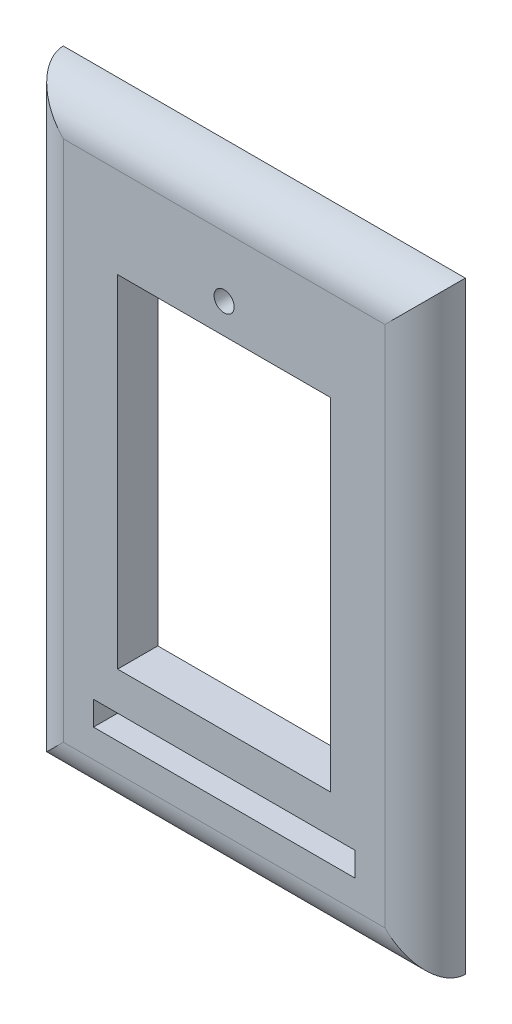
ISO-10303-21;
HEADER;
FILE_DESCRIPTION(('STEP AP214'),'2;1');
FILE_NAME('part.step','',(''),(''),'','','');
FILE_SCHEMA(('AUTOMOTIVE_DESIGN { 1 0 10303 214 1 1 1 1 }'));
ENDSEC;
DATA;
#1=APPLICATION_CONTEXT('core data for automotive mechanical design processes');
#2=APPLICATION_PROTOCOL_DEFINITION('international standard','automotive_design',2000,#1);
#3=PRODUCT_CONTEXT('',#1,'mechanical');
#4=PRODUCT('Part','Part','',(#3));
#5=PRODUCT_RELATED_PRODUCT_CATEGORY('part','',(#4));
#6=PRODUCT_DEFINITION_FORMATION('','',#4);
#7=PRODUCT_DEFINITION_CONTEXT('part definition',#1,'design');
#8=PRODUCT_DEFINITION('design','',#6,#7);
#9=PRODUCT_DEFINITION_SHAPE('','',#8);
#10=(LENGTH_UNIT() NAMED_UNIT(*) SI_UNIT(.MILLI.,.METRE.));
#11=(NAMED_UNIT(*) PLANE_ANGLE_UNIT() SI_UNIT($,.RADIAN.));
#12=(NAMED_UNIT(*) SI_UNIT($,.STERADIAN.) SOLID_ANGLE_UNIT());
#13=UNCERTAINTY_MEASURE_WITH_UNIT(LENGTH_MEASURE(1.E-05),#10,'distance_accuracy_value','');
#14=(GEOMETRIC_REPRESENTATION_CONTEXT(3) GLOBAL_UNCERTAINTY_ASSIGNED_CONTEXT((#13)) GLOBAL_UNIT_ASSIGNED_CONTEXT((#10,
#11,#12)) REPRESENTATION_CONTEXT('',''));
#15=CARTESIAN_POINT('',(0.,0.,0.));
#16=DIRECTION('',(0.,0.,1.));
#17=DIRECTION('',(1.,0.,0.));
#18=AXIS2_PLACEMENT_3D('',#15,#16,#17);
#19=CARTESIAN_POINT('',(0.,65.,0.));
#20=DIRECTION('',(1.,0.,0.));
#21=DIRECTION('',(0.,0.,-1.));
#22=AXIS2_PLACEMENT_3D('',#19,#20,#21);
#23=CYLINDRICAL_SURFACE('',#22,10.);
#24=CARTESIAN_POINT('',(-40.,65.,0.));
#25=DIRECTION('',(0.707106781186547,0.707106781186547,0.));
#26=DIRECTION('',(-0.707106781186547,0.707106781186547,0.));
#27=AXIS2_PLACEMENT_3D('',#24,#25,#26);
#28=ELLIPSE('',#27,14.1421356237309,10.);
#29=CARTESIAN_POINT('',(-40.,65.,10.));
#30=VERTEX_POINT('',#29);
#31=CARTESIAN_POINT('',(-50.,75.,0.));
#32=VERTEX_POINT('',#31);
#33=EDGE_CURVE('E11',#30,#32,#28,.F.);
#34=ORIENTED_EDGE('',*,*,#33,.F.);
#35=DIRECTION('',(-1.,0.,0.));
#36=VECTOR('',#35,1.);
#37=CARTESIAN_POINT('',(0.,65.,10.));
#38=LINE('',#37,#36);
#39=CARTESIAN_POINT('',(40.,65.,10.));
#40=VERTEX_POINT('',#39);
#41=EDGE_CURVE('E206',#40,#30,#38,.T.);
#42=ORIENTED_EDGE('',*,*,#41,.F.);
#43=CARTESIAN_POINT('',(40.,65.,0.));
#44=DIRECTION('',(0.707106781186547,-0.707106781186547,0.));
#45=DIRECTION('',(0.707106781186547,0.707106781186547,0.));
#46=AXIS2_PLACEMENT_3D('',#43,#44,#45);
#47=ELLIPSE('',#46,14.1421356237309,10.);
#48=CARTESIAN_POINT('',(50.,75.,0.));
#49=VERTEX_POINT('',#48);
#50=EDGE_CURVE('E40',#40,#49,#47,.F.);
#51=ORIENTED_EDGE('',*,*,#50,.T.);
#52=DIRECTION('',(-1.,0.,0.));
#53=VECTOR('',#52,1.);
#54=CARTESIAN_POINT('',(50.,75.,0.));
#55=LINE('',#54,#53);
#56=EDGE_CURVE('E203',#49,#32,#55,.T.);
#57=ORIENTED_EDGE('',*,*,#56,.T.);
#58=EDGE_LOOP('',(#34,#42,#51,#57));
#59=FACE_BOUND('',#58,.T.);
#60=ADVANCED_FACE('F33',(#59),#23,.T.);
#61=CARTESIAN_POINT('',(40.,0.,0.));
#62=DIRECTION('',(0.,-1.,0.));
#63=DIRECTION('',(0.,0.,-1.));
#64=AXIS2_PLACEMENT_3D('',#61,#62,#63);
#65=CYLINDRICAL_SURFACE('',#64,10.);
#66=ORIENTED_EDGE('',*,*,#50,.F.);
#67=DIRECTION('',(0.,1.,0.));
#68=VECTOR('',#67,1.);
#69=CARTESIAN_POINT('',(40.,0.,10.));
#70=LINE('',#69,#68);
#71=CARTESIAN_POINT('',(40.,-65.,10.));
#72=VERTEX_POINT('',#71);
#73=EDGE_CURVE('E209',#72,#40,#70,.T.);
#74=ORIENTED_EDGE('',*,*,#73,.F.);
#75=CARTESIAN_POINT('',(40.,-65.,0.));
#76=DIRECTION('',(-0.707106781186547,-0.707106781186548,0.));
#77=DIRECTION('',(0.707106781186548,-0.707106781186547,0.));
#78=AXIS2_PLACEMENT_3D('',#75,#76,#77);
#79=ELLIPSE('',#78,14.1421356237309,10.);
#80=CARTESIAN_POINT('',(50.,-75.,0.));
#81=VERTEX_POINT('',#80);
#82=EDGE_CURVE('E220',#72,#81,#79,.F.);
#83=ORIENTED_EDGE('',*,*,#82,.T.);
#84=DIRECTION('',(0.,1.,0.));
#85=VECTOR('',#84,1.);
#86=CARTESIAN_POINT('',(50.,-75.,0.));
#87=LINE('',#86,#85);
#88=EDGE_CURVE('E200',#81,#49,#87,.T.);
#89=ORIENTED_EDGE('',*,*,#88,.T.);
#90=EDGE_LOOP('',(#66,#74,#83,#89));
#91=FACE_BOUND('',#90,.T.);
#92=ADVANCED_FACE('F228',(#91),#65,.T.);
#93=CARTESIAN_POINT('',(0.,-65.,0.));
#94=DIRECTION('',(-1.,0.,0.));
#95=DIRECTION('',(0.,-1.,0.));
#96=AXIS2_PLACEMENT_3D('',#93,#94,#95);
#97=CYLINDRICAL_SURFACE('',#96,10.);
#98=ORIENTED_EDGE('',*,*,#82,.F.);
#99=DIRECTION('',(1.,0.,0.));
#100=VECTOR('',#99,1.);
#101=CARTESIAN_POINT('',(0.,-65.,10.));
#102=LINE('',#101,#100);
#103=CARTESIAN_POINT('',(-40.,-65.,10.));
#104=VERTEX_POINT('',#103);
#105=EDGE_CURVE('E212',#104,#72,#102,.T.);
#106=ORIENTED_EDGE('',*,*,#105,.F.);
#107=CARTESIAN_POINT('',(-40.,-65.,0.));
#108=DIRECTION('',(-0.707106781186548,0.707106781186547,0.));
#109=DIRECTION('',(-0.707106781186547,-0.707106781186548,0.));
#110=AXIS2_PLACEMENT_3D('',#107,#108,#109);
#111=ELLIPSE('',#110,14.142135623731,10.);
#112=CARTESIAN_POINT('',(-50.,-75.,0.));
#113=VERTEX_POINT('',#112);
#114=EDGE_CURVE('E218',#104,#113,#111,.F.);
#115=ORIENTED_EDGE('',*,*,#114,.T.);
#116=DIRECTION('',(1.,0.,0.));
#117=VECTOR('',#116,1.);
#118=CARTESIAN_POINT('',(50.,-75.,0.));
#119=LINE('',#118,#117);
#120=EDGE_CURVE('E197',#113,#81,#119,.T.);
#121=ORIENTED_EDGE('',*,*,#120,.T.);
#122=EDGE_LOOP('',(#98,#106,#115,#121));
#123=FACE_BOUND('',#122,.T.);
#124=ADVANCED_FACE('F238',(#123),#97,.T.);
#125=CARTESIAN_POINT('',(-40.,0.,0.));
#126=DIRECTION('',(0.,1.,0.));
#127=DIRECTION('',(0.,0.,1.));
#128=AXIS2_PLACEMENT_3D('',#125,#126,#127);
#129=CYLINDRICAL_SURFACE('',#128,10.);
#130=DIRECTION('',(0.,-1.,0.));
#131=VECTOR('',#130,1.);
#132=CARTESIAN_POINT('',(-40.,0.,10.));
#133=LINE('',#132,#131);
#134=EDGE_CURVE('E215',#30,#104,#133,.T.);
#135=ORIENTED_EDGE('',*,*,#134,.F.);
#136=ORIENTED_EDGE('',*,*,#33,.T.);
#137=DIRECTION('',(0.,-1.,0.));
#138=VECTOR('',#137,1.);
#139=CARTESIAN_POINT('',(-50.,-75.,0.));
#140=LINE('',#139,#138);
#141=EDGE_CURVE('E192',#32,#113,#140,.T.);
#142=ORIENTED_EDGE('',*,*,#141,.T.);
#143=ORIENTED_EDGE('',*,*,#114,.F.);
#144=EDGE_LOOP('',(#135,#136,#142,#143));
#145=FACE_BOUND('',#144,.T.);
#146=ADVANCED_FACE('F233',(#145),#129,.T.);
#147=CARTESIAN_POINT('',(0.,0.,10.));
#148=DIRECTION('',(0.,0.,1.));
#149=DIRECTION('',(1.,0.,0.));
#150=AXIS2_PLACEMENT_3D('',#147,#148,#149);
#151=PLANE('',#150);
#152=DIRECTION('',(0.,-1.,0.));
#153=VECTOR('',#152,1.);
#154=CARTESIAN_POINT('',(-32.4999999999999,-58.,10.));
#155=LINE('',#154,#153);
#156=CARTESIAN_POINT('',(-32.4999999999999,-52.,10.));
#157=VERTEX_POINT('',#156);
#158=CARTESIAN_POINT('',(-32.4999999999999,-58.,10.));
#159=VERTEX_POINT('',#158);
#160=EDGE_CURVE('E47',#157,#159,#155,.T.);
#161=ORIENTED_EDGE('',*,*,#160,.F.);
#162=DIRECTION('',(-1.,0.,0.));
#163=VECTOR('',#162,1.);
#164=CARTESIAN_POINT('',(32.5000000000001,-52.,10.));
#165=LINE('',#164,#163);
#166=CARTESIAN_POINT('',(32.5000000000001,-52.,10.));
#167=VERTEX_POINT('',#166);
#168=EDGE_CURVE('E138',#167,#157,#165,.T.);
#169=ORIENTED_EDGE('',*,*,#168,.F.);
#170=DIRECTION('',(0.,1.,0.));
#171=VECTOR('',#170,1.);
#172=CARTESIAN_POINT('',(32.5000000000001,-58.,10.));
#173=LINE('',#172,#171);
#174=CARTESIAN_POINT('',(32.5000000000001,-58.,10.));
#175=VERTEX_POINT('',#174);
#176=EDGE_CURVE('E141',#175,#167,#173,.T.);
#177=ORIENTED_EDGE('',*,*,#176,.F.);
#178=DIRECTION('',(1.,0.,0.));
#179=VECTOR('',#178,1.);
#180=CARTESIAN_POINT('',(32.5000000000001,-58.,10.));
#181=LINE('',#180,#179);
#182=EDGE_CURVE('E147',#159,#175,#181,.T.);
#183=ORIENTED_EDGE('',*,*,#182,.F.);
#184=EDGE_LOOP('',(#161,#169,#177,#183));
#185=FACE_BOUND('',#184,.T.);
#186=DIRECTION('',(0.,-1.,0.));
#187=VECTOR('',#186,1.);
#188=CARTESIAN_POINT('',(-26.5,-42.5,10.));
#189=LINE('',#188,#187);
#190=CARTESIAN_POINT('',(-26.5,42.5,10.));
#191=VERTEX_POINT('',#190);
#192=CARTESIAN_POINT('',(-26.5,-42.5,10.));
#193=VERTEX_POINT('',#192);
#194=EDGE_CURVE('E153',#191,#193,#189,.T.);
#195=ORIENTED_EDGE('',*,*,#194,.F.);
#196=DIRECTION('',(-1.,0.,0.));
#197=VECTOR('',#196,1.);
#198=CARTESIAN_POINT('',(26.5,42.5,10.));
#199=LINE('',#198,#197);
#200=CARTESIAN_POINT('',(26.5,42.5,10.));
#201=VERTEX_POINT('',#200);
#202=EDGE_CURVE('E161',#201,#191,#199,.T.);
#203=ORIENTED_EDGE('',*,*,#202,.F.);
#204=DIRECTION('',(0.,1.,0.));
#205=VECTOR('',#204,1.);
#206=CARTESIAN_POINT('',(26.5,-42.5,10.));
#207=LINE('',#206,#205);
#208=CARTESIAN_POINT('',(26.5,-42.5,10.));
#209=VERTEX_POINT('',#208);
#210=EDGE_CURVE('E175',#209,#201,#207,.T.);
#211=ORIENTED_EDGE('',*,*,#210,.F.);
#212=DIRECTION('',(1.,0.,0.));
#213=VECTOR('',#212,1.);
#214=CARTESIAN_POINT('',(26.5,-42.5,10.));
#215=LINE('',#214,#213);
#216=EDGE_CURVE('E172',#193,#209,#215,.T.);
#217=ORIENTED_EDGE('',*,*,#216,.F.);
#218=EDGE_LOOP('',(#195,#203,#211,#217));
#219=FACE_BOUND('',#218,.T.);
#220=CARTESIAN_POINT('',(0.,50.,10.));
#221=DIRECTION('',(0.,0.,1.));
#222=DIRECTION('',(1.,0.,0.));
#223=AXIS2_PLACEMENT_3D('',#220,#221,#222);
#224=CIRCLE('',#223,2.5);
#225=CARTESIAN_POINT('',(2.5,50.,10.));
#226=VERTEX_POINT('',#225);
#227=EDGE_CURVE('E182',#226,#226,#224,.T.);
#228=ORIENTED_EDGE('',*,*,#227,.F.);
#229=EDGE_LOOP('',(#228));
#230=FACE_BOUND('',#229,.T.);
#231=ORIENTED_EDGE('',*,*,#41,.T.);
#232=ORIENTED_EDGE('',*,*,#134,.T.);
#233=ORIENTED_EDGE('',*,*,#105,.T.);
#234=ORIENTED_EDGE('',*,*,#73,.T.);
#235=EDGE_LOOP('',(#231,#232,#233,#234));
#236=FACE_BOUND('',#235,.T.);
#237=ADVANCED_FACE('F236',(#185,#219,#230,#236),#151,.T.);
#238=CARTESIAN_POINT('',(0.,0.,0.));
#239=DIRECTION('',(0.,0.,1.));
#240=DIRECTION('',(1.,0.,0.));
#241=AXIS2_PLACEMENT_3D('',#238,#239,#240);
#242=PLANE('',#241);
#243=DIRECTION('',(-1.,0.,0.));
#244=VECTOR('',#243,1.);
#245=CARTESIAN_POINT('',(32.5000000000001,-52.,0.));
#246=LINE('',#245,#244);
#247=CARTESIAN_POINT('',(32.5000000000001,-52.,0.));
#248=VERTEX_POINT('',#247);
#249=CARTESIAN_POINT('',(-32.4999999999999,-52.,0.));
#250=VERTEX_POINT('',#249);
#251=EDGE_CURVE('E128',#248,#250,#246,.T.);
#252=ORIENTED_EDGE('',*,*,#251,.T.);
#253=DIRECTION('',(0.,-1.,0.));
#254=VECTOR('',#253,1.);
#255=CARTESIAN_POINT('',(-32.4999999999999,-58.,0.));
#256=LINE('',#255,#254);
#257=CARTESIAN_POINT('',(-32.4999999999999,-58.,0.));
#258=VERTEX_POINT('',#257);
#259=EDGE_CURVE('E122',#250,#258,#256,.T.);
#260=ORIENTED_EDGE('',*,*,#259,.T.);
#261=DIRECTION('',(1.,0.,0.));
#262=VECTOR('',#261,1.);
#263=CARTESIAN_POINT('',(32.5000000000001,-58.,0.));
#264=LINE('',#263,#262);
#265=CARTESIAN_POINT('',(32.5000000000001,-58.,0.));
#266=VERTEX_POINT('',#265);
#267=EDGE_CURVE('E131',#258,#266,#264,.T.);
#268=ORIENTED_EDGE('',*,*,#267,.T.);
#269=DIRECTION('',(0.,1.,0.));
#270=VECTOR('',#269,1.);
#271=CARTESIAN_POINT('',(32.5000000000001,-58.,0.));
#272=LINE('',#271,#270);
#273=EDGE_CURVE('E55',#266,#248,#272,.T.);
#274=ORIENTED_EDGE('',*,*,#273,.T.);
#275=EDGE_LOOP('',(#252,#260,#268,#274));
#276=FACE_BOUND('',#275,.T.);
#277=DIRECTION('',(-1.,0.,0.));
#278=VECTOR('',#277,1.);
#279=CARTESIAN_POINT('',(26.5,42.5,0.));
#280=LINE('',#279,#278);
#281=CARTESIAN_POINT('',(26.5,42.5,0.));
#282=VERTEX_POINT('',#281);
#283=CARTESIAN_POINT('',(-26.5,42.5,0.));
#284=VERTEX_POINT('',#283);
#285=EDGE_CURVE('E167',#282,#284,#280,.T.);
#286=ORIENTED_EDGE('',*,*,#285,.T.);
#287=DIRECTION('',(0.,-1.,0.));
#288=VECTOR('',#287,1.);
#289=CARTESIAN_POINT('',(-26.5,-42.5,0.));
#290=LINE('',#289,#288);
#291=CARTESIAN_POINT('',(-26.5,-42.5,0.));
#292=VERTEX_POINT('',#291);
#293=EDGE_CURVE('E157',#284,#292,#290,.T.);
#294=ORIENTED_EDGE('',*,*,#293,.T.);
#295=DIRECTION('',(1.,0.,0.));
#296=VECTOR('',#295,1.);
#297=CARTESIAN_POINT('',(26.5,-42.5,0.));
#298=LINE('',#297,#296);
#299=CARTESIAN_POINT('',(26.5,-42.5,0.));
#300=VERTEX_POINT('',#299);
#301=EDGE_CURVE('E160',#292,#300,#298,.T.);
#302=ORIENTED_EDGE('',*,*,#301,.T.);
#303=DIRECTION('',(0.,1.,0.));
#304=VECTOR('',#303,1.);
#305=CARTESIAN_POINT('',(26.5,-42.5,0.));
#306=LINE('',#305,#304);
#307=EDGE_CURVE('E164',#300,#282,#306,.T.);
#308=ORIENTED_EDGE('',*,*,#307,.T.);
#309=EDGE_LOOP('',(#286,#294,#302,#308));
#310=FACE_BOUND('',#309,.T.);
#311=CARTESIAN_POINT('',(0.,50.,0.));
#312=DIRECTION('',(0.,0.,1.));
#313=DIRECTION('',(1.,0.,0.));
#314=AXIS2_PLACEMENT_3D('',#311,#312,#313);
#315=CIRCLE('',#314,2.5);
#316=CARTESIAN_POINT('',(2.5,50.,0.));
#317=VERTEX_POINT('',#316);
#318=EDGE_CURVE('E189',#317,#317,#315,.T.);
#319=ORIENTED_EDGE('',*,*,#318,.T.);
#320=EDGE_LOOP('',(#319));
#321=FACE_BOUND('',#320,.T.);
#322=ORIENTED_EDGE('',*,*,#141,.F.);
#323=ORIENTED_EDGE('',*,*,#56,.F.);
#324=ORIENTED_EDGE('',*,*,#88,.F.);
#325=ORIENTED_EDGE('',*,*,#120,.F.);
#326=EDGE_LOOP('',(#322,#323,#324,#325));
#327=FACE_BOUND('',#326,.T.);
#328=ADVANCED_FACE('F135',(#276,#310,#321,#327),#242,.F.);
#329=CARTESIAN_POINT('',(0.,50.,0.));
#330=DIRECTION('',(0.,0.,1.));
#331=DIRECTION('',(1.,0.,0.));
#332=AXIS2_PLACEMENT_3D('',#329,#330,#331);
#333=CYLINDRICAL_SURFACE('',#332,2.5);
#334=ORIENTED_EDGE('',*,*,#318,.F.);
#335=EDGE_LOOP('',(#334));
#336=FACE_BOUND('',#335,.T.);
#337=ORIENTED_EDGE('',*,*,#227,.T.);
#338=EDGE_LOOP('',(#337));
#339=FACE_BOUND('',#338,.T.);
#340=ADVANCED_FACE('F270',(#336,#339),#333,.F.);
#341=CARTESIAN_POINT('',(-26.5,-42.5,0.));
#342=DIRECTION('',(-1.,0.,0.));
#343=DIRECTION('',(0.,0.,1.));
#344=AXIS2_PLACEMENT_3D('',#341,#342,#343);
#345=PLANE('',#344);
#346=ORIENTED_EDGE('',*,*,#194,.T.);
#347=DIRECTION('',(0.,0.,1.));
#348=VECTOR('',#347,1.);
#349=CARTESIAN_POINT('',(-26.5,-42.5,0.));
#350=LINE('',#349,#348);
#351=EDGE_CURVE('E170',#292,#193,#350,.T.);
#352=ORIENTED_EDGE('',*,*,#351,.F.);
#353=ORIENTED_EDGE('',*,*,#293,.F.);
#354=DIRECTION('',(0.,0.,1.));
#355=VECTOR('',#354,1.);
#356=CARTESIAN_POINT('',(-26.5,42.5,0.));
#357=LINE('',#356,#355);
#358=EDGE_CURVE('E180',#284,#191,#357,.T.);
#359=ORIENTED_EDGE('',*,*,#358,.T.);
#360=EDGE_LOOP('',(#346,#352,#353,#359));
#361=FACE_BOUND('',#360,.T.);
#362=ADVANCED_FACE('F274',(#361),#345,.F.);
#363=CARTESIAN_POINT('',(26.5,42.5,0.));
#364=DIRECTION('',(0.,1.,0.));
#365=DIRECTION('',(0.,0.,1.));
#366=AXIS2_PLACEMENT_3D('',#363,#364,#365);
#367=PLANE('',#366);
#368=ORIENTED_EDGE('',*,*,#202,.T.);
#369=ORIENTED_EDGE('',*,*,#358,.F.);
#370=ORIENTED_EDGE('',*,*,#285,.F.);
#371=DIRECTION('',(0.,0.,1.));
#372=VECTOR('',#371,1.);
#373=CARTESIAN_POINT('',(26.5,42.5,0.));
#374=LINE('',#373,#372);
#375=EDGE_CURVE('E183',#282,#201,#374,.T.);
#376=ORIENTED_EDGE('',*,*,#375,.T.);
#377=EDGE_LOOP('',(#368,#369,#370,#376));
#378=FACE_BOUND('',#377,.T.);
#379=ADVANCED_FACE('F285',(#378),#367,.F.);
#380=CARTESIAN_POINT('',(26.5,-42.5,0.));
#381=DIRECTION('',(1.,0.,0.));
#382=DIRECTION('',(0.,0.,-1.));
#383=AXIS2_PLACEMENT_3D('',#380,#381,#382);
#384=PLANE('',#383);
#385=ORIENTED_EDGE('',*,*,#210,.T.);
#386=ORIENTED_EDGE('',*,*,#375,.F.);
#387=ORIENTED_EDGE('',*,*,#307,.F.);
#388=DIRECTION('',(0.,0.,1.));
#389=VECTOR('',#388,1.);
#390=CARTESIAN_POINT('',(26.5,-42.5,0.));
#391=LINE('',#390,#389);
#392=EDGE_CURVE('E185',#300,#209,#391,.T.);
#393=ORIENTED_EDGE('',*,*,#392,.T.);
#394=EDGE_LOOP('',(#385,#386,#387,#393));
#395=FACE_BOUND('',#394,.T.);
#396=ADVANCED_FACE('F295',(#395),#384,.F.);
#397=CARTESIAN_POINT('',(26.5,-42.5,0.));
#398=DIRECTION('',(0.,-1.,0.));
#399=DIRECTION('',(1.,0.,0.));
#400=AXIS2_PLACEMENT_3D('',#397,#398,#399);
#401=PLANE('',#400);
#402=ORIENTED_EDGE('',*,*,#216,.T.);
#403=ORIENTED_EDGE('',*,*,#392,.F.);
#404=ORIENTED_EDGE('',*,*,#301,.F.);
#405=ORIENTED_EDGE('',*,*,#351,.T.);
#406=EDGE_LOOP('',(#402,#403,#404,#405));
#407=FACE_BOUND('',#406,.T.);
#408=ADVANCED_FACE('F305',(#407),#401,.F.);
#409=CARTESIAN_POINT('',(-32.4999999999999,-58.,0.));
#410=DIRECTION('',(-1.,0.,0.));
#411=DIRECTION('',(0.,0.,1.));
#412=AXIS2_PLACEMENT_3D('',#409,#410,#411);
#413=PLANE('',#412);
#414=ORIENTED_EDGE('',*,*,#160,.T.);
#415=DIRECTION('',(0.,0.,1.));
#416=VECTOR('',#415,1.);
#417=CARTESIAN_POINT('',(-32.4999999999999,-58.,0.));
#418=LINE('',#417,#416);
#419=EDGE_CURVE('E118',#258,#159,#418,.T.);
#420=ORIENTED_EDGE('',*,*,#419,.F.);
#421=ORIENTED_EDGE('',*,*,#259,.F.);
#422=DIRECTION('',(0.,0.,1.));
#423=VECTOR('',#422,1.);
#424=CARTESIAN_POINT('',(-32.4999999999999,-52.,0.));
#425=LINE('',#424,#423);
#426=EDGE_CURVE('E151',#250,#157,#425,.T.);
#427=ORIENTED_EDGE('',*,*,#426,.T.);
#428=EDGE_LOOP('',(#414,#420,#421,#427));
#429=FACE_BOUND('',#428,.T.);
#430=ADVANCED_FACE('F120',(#429),#413,.F.);
#431=CARTESIAN_POINT('',(32.5000000000001,-52.,0.));
#432=DIRECTION('',(0.,1.,0.));
#433=DIRECTION('',(-1.,0.,0.));
#434=AXIS2_PLACEMENT_3D('',#431,#432,#433);
#435=PLANE('',#434);
#436=ORIENTED_EDGE('',*,*,#168,.T.);
#437=ORIENTED_EDGE('',*,*,#426,.F.);
#438=ORIENTED_EDGE('',*,*,#251,.F.);
#439=DIRECTION('',(0.,0.,1.));
#440=VECTOR('',#439,1.);
#441=CARTESIAN_POINT('',(32.5000000000001,-52.,0.));
#442=LINE('',#441,#440);
#443=EDGE_CURVE('E154',#248,#167,#442,.T.);
#444=ORIENTED_EDGE('',*,*,#443,.T.);
#445=EDGE_LOOP('',(#436,#437,#438,#444));
#446=FACE_BOUND('',#445,.T.);
#447=ADVANCED_FACE('F339',(#446),#435,.F.);
#448=CARTESIAN_POINT('',(32.5000000000001,-58.,0.));
#449=DIRECTION('',(1.,0.,0.));
#450=DIRECTION('',(0.,0.,-1.));
#451=AXIS2_PLACEMENT_3D('',#448,#449,#450);
#452=PLANE('',#451);
#453=ORIENTED_EDGE('',*,*,#176,.T.);
#454=ORIENTED_EDGE('',*,*,#443,.F.);
#455=ORIENTED_EDGE('',*,*,#273,.F.);
#456=DIRECTION('',(0.,0.,1.));
#457=VECTOR('',#456,1.);
#458=CARTESIAN_POINT('',(32.5000000000001,-58.,0.));
#459=LINE('',#458,#457);
#460=EDGE_CURVE('E127',#266,#175,#459,.T.);
#461=ORIENTED_EDGE('',*,*,#460,.T.);
#462=EDGE_LOOP('',(#453,#454,#455,#461));
#463=FACE_BOUND('',#462,.T.);
#464=ADVANCED_FACE('F348',(#463),#452,.F.);
#465=CARTESIAN_POINT('',(32.5000000000001,-58.,0.));
#466=DIRECTION('',(0.,-1.,0.));
#467=DIRECTION('',(1.,0.,0.));
#468=AXIS2_PLACEMENT_3D('',#465,#466,#467);
#469=PLANE('',#468);
#470=ORIENTED_EDGE('',*,*,#182,.T.);
#471=ORIENTED_EDGE('',*,*,#460,.F.);
#472=ORIENTED_EDGE('',*,*,#267,.F.);
#473=ORIENTED_EDGE('',*,*,#419,.T.);
#474=EDGE_LOOP('',(#470,#471,#472,#473));
#475=FACE_BOUND('',#474,.T.);
#476=ADVANCED_FACE('F132',(#475),#469,.F.);
#477=CLOSED_SHELL('',(#60,#92,#124,#146,#237,#328,#340,#362,#379,#396,#408,#430,#447,#464,#476));
#478=MANIFOLD_SOLID_BREP('B2',#477);
#479=ADVANCED_BREP_SHAPE_REPRESENTATION('',(#18,#478),#14);
#480=SHAPE_DEFINITION_REPRESENTATION(#9,#479);
ENDSEC;
END-ISO-10303-21;
